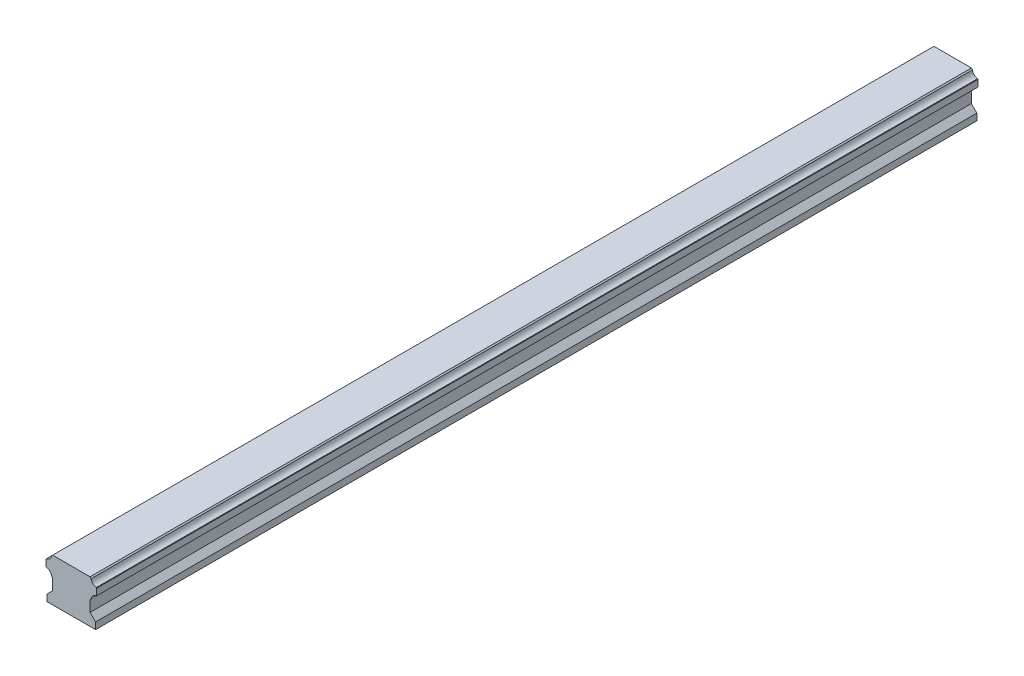
ISO-10303-21;
HEADER;
FILE_DESCRIPTION(('STEP AP214'),'2;1');
FILE_NAME('part.step','',(''),(''),'','','');
FILE_SCHEMA(('AUTOMOTIVE_DESIGN { 1 0 10303 214 1 1 1 1 }'));
ENDSEC;
DATA;
#1=APPLICATION_CONTEXT('core data for automotive mechanical design processes');
#2=APPLICATION_PROTOCOL_DEFINITION('international standard','automotive_design',2000,#1);
#3=PRODUCT_CONTEXT('',#1,'mechanical');
#4=PRODUCT('Part','Part','',(#3));
#5=PRODUCT_RELATED_PRODUCT_CATEGORY('part','',(#4));
#6=PRODUCT_DEFINITION_FORMATION('','',#4);
#7=PRODUCT_DEFINITION_CONTEXT('part definition',#1,'design');
#8=PRODUCT_DEFINITION('design','',#6,#7);
#9=PRODUCT_DEFINITION_SHAPE('','',#8);
#10=(LENGTH_UNIT() NAMED_UNIT(*) SI_UNIT(.MILLI.,.METRE.));
#11=(NAMED_UNIT(*) PLANE_ANGLE_UNIT() SI_UNIT($,.RADIAN.));
#12=(NAMED_UNIT(*) SI_UNIT($,.STERADIAN.) SOLID_ANGLE_UNIT());
#13=UNCERTAINTY_MEASURE_WITH_UNIT(LENGTH_MEASURE(1.E-05),#10,'distance_accuracy_value','');
#14=(GEOMETRIC_REPRESENTATION_CONTEXT(3) GLOBAL_UNCERTAINTY_ASSIGNED_CONTEXT((#13)) GLOBAL_UNIT_ASSIGNED_CONTEXT((#10,
#11,#12)) REPRESENTATION_CONTEXT('',''));
#15=CARTESIAN_POINT('',(0.,0.,0.));
#16=DIRECTION('',(0.,0.,1.));
#17=DIRECTION('',(1.,0.,0.));
#18=AXIS2_PLACEMENT_3D('',#15,#16,#17);
#19=CARTESIAN_POINT('',(12.4987883979856,-8.46322794005069,400.));
#20=DIRECTION('',(0.,0.,-1.));
#21=DIRECTION('',(-1.,0.,0.));
#22=AXIS2_PLACEMENT_3D('',#19,#20,#21);
#23=CYLINDRICAL_SURFACE('',#22,2.5);
#24=CARTESIAN_POINT('',(12.4987883979856,-8.46322794005069,0.));
#25=DIRECTION('',(0.,0.,1.));
#26=DIRECTION('',(1.,0.,0.));
#27=AXIS2_PLACEMENT_3D('',#24,#25,#26);
#28=CIRCLE('',#27,2.5);
#29=CARTESIAN_POINT('',(12.3041980430387,-5.97081252648865,0.));
#30=VERTEX_POINT('',#29);
#31=CARTESIAN_POINT('',(10.0063729844235,-8.26863758510385,0.));
#32=VERTEX_POINT('',#31);
#33=EDGE_CURVE('E211',#30,#32,#28,.T.);
#34=ORIENTED_EDGE('',*,*,#33,.F.);
#35=DIRECTION('',(0.,0.,-1.));
#36=VECTOR('',#35,1.);
#37=CARTESIAN_POINT('',(12.3041980430387,-5.97081252648865,400.));
#38=LINE('',#37,#36);
#39=CARTESIAN_POINT('',(12.3041980430387,-5.97081252648865,400.));
#40=VERTEX_POINT('',#39);
#41=EDGE_CURVE('E11',#40,#30,#38,.T.);
#42=ORIENTED_EDGE('',*,*,#41,.F.);
#43=CARTESIAN_POINT('',(12.4987883979856,-8.46322794005069,400.));
#44=DIRECTION('',(0.,0.,1.));
#45=DIRECTION('',(1.,0.,0.));
#46=AXIS2_PLACEMENT_3D('',#43,#44,#45);
#47=CIRCLE('',#46,2.5);
#48=CARTESIAN_POINT('',(10.0063729844235,-8.26863758510385,400.));
#49=VERTEX_POINT('',#48);
#50=EDGE_CURVE('E271',#40,#49,#47,.T.);
#51=ORIENTED_EDGE('',*,*,#50,.T.);
#52=DIRECTION('',(0.,0.,-1.));
#53=VECTOR('',#52,1.);
#54=CARTESIAN_POINT('',(10.0063729844235,-8.26863758510385,400.));
#55=LINE('',#54,#53);
#56=EDGE_CURVE('E51',#49,#32,#55,.T.);
#57=ORIENTED_EDGE('',*,*,#56,.T.);
#58=EDGE_LOOP('',(#34,#42,#51,#57));
#59=FACE_BOUND('',#58,.T.);
#60=ADVANCED_FACE('F35',(#59),#23,.F.);
#61=CARTESIAN_POINT('',(9.13750528476369,-9.13750528476369,400.));
#62=DIRECTION('',(0.707106781186548,-0.707106781186548,0.));
#63=DIRECTION('',(0.707106781186548,0.707106781186548,0.));
#64=AXIS2_PLACEMENT_3D('',#61,#62,#63);
#65=PLANE('',#64);
#66=DIRECTION('',(-0.707106781186548,-0.707106781186548,0.));
#67=VECTOR('',#66,1.);
#68=CARTESIAN_POINT('',(9.13750528476369,-9.13750528476369,0.));
#69=LINE('',#68,#67);
#70=CARTESIAN_POINT('',(12.4987883979856,-5.77622217154175,0.));
#71=VERTEX_POINT('',#70);
#72=EDGE_CURVE('E213',#71,#30,#69,.T.);
#73=ORIENTED_EDGE('',*,*,#72,.F.);
#74=DIRECTION('',(0.,0.,-1.));
#75=VECTOR('',#74,1.);
#76=CARTESIAN_POINT('',(12.4987883979856,-5.77622217154175,400.));
#77=LINE('',#76,#75);
#78=CARTESIAN_POINT('',(12.4987883979856,-5.77622217154175,400.));
#79=VERTEX_POINT('',#78);
#80=EDGE_CURVE('E43',#79,#71,#77,.T.);
#81=ORIENTED_EDGE('',*,*,#80,.F.);
#82=DIRECTION('',(-0.707106781186548,-0.707106781186548,0.));
#83=VECTOR('',#82,1.);
#84=CARTESIAN_POINT('',(9.13750528476369,-9.13750528476369,400.));
#85=LINE('',#84,#83);
#86=EDGE_CURVE('E330',#79,#40,#85,.T.);
#87=ORIENTED_EDGE('',*,*,#86,.T.);
#88=ORIENTED_EDGE('',*,*,#41,.T.);
#89=EDGE_LOOP('',(#73,#81,#87,#88));
#90=FACE_BOUND('',#89,.T.);
#91=ADVANCED_FACE('F318',(#90),#65,.T.);
#92=CARTESIAN_POINT('',(12.4987883979856,0.,400.));
#93=DIRECTION('',(1.,0.,0.));
#94=DIRECTION('',(0.,0.,-1.));
#95=AXIS2_PLACEMENT_3D('',#92,#93,#94);
#96=PLANE('',#95);
#97=DIRECTION('',(0.,-1.,0.));
#98=VECTOR('',#97,1.);
#99=CARTESIAN_POINT('',(12.4987883979856,0.,0.));
#100=LINE('',#99,#98);
#101=CARTESIAN_POINT('',(12.4987883979856,-2.77622217154181,0.));
#102=VERTEX_POINT('',#101);
#103=EDGE_CURVE('E216',#102,#71,#100,.T.);
#104=ORIENTED_EDGE('',*,*,#103,.F.);
#105=DIRECTION('',(0.,0.,-1.));
#106=VECTOR('',#105,1.);
#107=CARTESIAN_POINT('',(12.4987883979856,-2.77622217154181,400.));
#108=LINE('',#107,#106);
#109=CARTESIAN_POINT('',(12.4987883979856,-2.77622217154181,400.));
#110=VERTEX_POINT('',#109);
#111=EDGE_CURVE('E307',#110,#102,#108,.T.);
#112=ORIENTED_EDGE('',*,*,#111,.F.);
#113=DIRECTION('',(0.,-1.,0.));
#114=VECTOR('',#113,1.);
#115=CARTESIAN_POINT('',(12.4987883979856,0.,400.));
#116=LINE('',#115,#114);
#117=EDGE_CURVE('E314',#110,#79,#116,.T.);
#118=ORIENTED_EDGE('',*,*,#117,.T.);
#119=ORIENTED_EDGE('',*,*,#80,.T.);
#120=EDGE_LOOP('',(#104,#112,#118,#119));
#121=FACE_BOUND('',#120,.T.);
#122=ADVANCED_FACE('F312',(#121),#96,.T.);
#123=CARTESIAN_POINT('',(4.86128311322192,4.86128311322192,400.));
#124=DIRECTION('',(0.707106781186548,0.707106781186548,0.));
#125=DIRECTION('',(-0.707106781186548,0.707106781186548,0.));
#126=AXIS2_PLACEMENT_3D('',#123,#124,#125);
#127=PLANE('',#126);
#128=DIRECTION('',(0.707106781186548,-0.707106781186548,0.));
#129=VECTOR('',#128,1.);
#130=CARTESIAN_POINT('',(4.86128311322192,4.86128311322192,0.));
#131=LINE('',#130,#129);
#132=CARTESIAN_POINT('',(12.3041980430388,-2.58163181659496,0.));
#133=VERTEX_POINT('',#132);
#134=EDGE_CURVE('E219',#133,#102,#131,.T.);
#135=ORIENTED_EDGE('',*,*,#134,.F.);
#136=DIRECTION('',(0.,0.,-1.));
#137=VECTOR('',#136,1.);
#138=CARTESIAN_POINT('',(12.3041980430388,-2.58163181659496,400.));
#139=LINE('',#138,#137);
#140=CARTESIAN_POINT('',(12.3041980430388,-2.58163181659496,400.));
#141=VERTEX_POINT('',#140);
#142=EDGE_CURVE('E305',#141,#133,#139,.T.);
#143=ORIENTED_EDGE('',*,*,#142,.F.);
#144=DIRECTION('',(0.707106781186548,-0.707106781186548,0.));
#145=VECTOR('',#144,1.);
#146=CARTESIAN_POINT('',(4.86128311322192,4.86128311322192,400.));
#147=LINE('',#146,#145);
#148=EDGE_CURVE('E327',#141,#110,#147,.T.);
#149=ORIENTED_EDGE('',*,*,#148,.T.);
#150=ORIENTED_EDGE('',*,*,#111,.T.);
#151=EDGE_LOOP('',(#135,#143,#149,#150));
#152=FACE_BOUND('',#151,.T.);
#153=ADVANCED_FACE('F324',(#152),#127,.T.);
#154=CARTESIAN_POINT('',(12.4987883979856,-0.0892164030329295,400.));
#155=DIRECTION('',(0.,0.,-1.));
#156=DIRECTION('',(-1.,0.,0.));
#157=AXIS2_PLACEMENT_3D('',#154,#155,#156);
#158=CYLINDRICAL_SURFACE('',#157,2.49999999999998);
#159=CARTESIAN_POINT('',(12.4987883979856,-0.0892164030329295,0.));
#160=DIRECTION('',(0.,0.,1.));
#161=DIRECTION('',(1.,0.,0.));
#162=AXIS2_PLACEMENT_3D('',#159,#160,#161);
#163=CIRCLE('',#162,2.49999999999998);
#164=CARTESIAN_POINT('',(10.0063729844236,-0.283806757979913,0.));
#165=VERTEX_POINT('',#164);
#166=EDGE_CURVE('E222',#165,#133,#163,.T.);
#167=ORIENTED_EDGE('',*,*,#166,.F.);
#168=DIRECTION('',(0.,0.,-1.));
#169=VECTOR('',#168,1.);
#170=CARTESIAN_POINT('',(10.0063729844236,-0.283806757979913,400.));
#171=LINE('',#170,#169);
#172=CARTESIAN_POINT('',(10.0063729844236,-0.283806757979913,400.));
#173=VERTEX_POINT('',#172);
#174=EDGE_CURVE('E303',#173,#165,#171,.T.);
#175=ORIENTED_EDGE('',*,*,#174,.F.);
#176=CARTESIAN_POINT('',(12.4987883979856,-0.0892164030329295,400.));
#177=DIRECTION('',(0.,0.,1.));
#178=DIRECTION('',(1.,0.,0.));
#179=AXIS2_PLACEMENT_3D('',#176,#177,#178);
#180=CIRCLE('',#179,2.49999999999998);
#181=EDGE_CURVE('E332',#173,#141,#180,.T.);
#182=ORIENTED_EDGE('',*,*,#181,.T.);
#183=ORIENTED_EDGE('',*,*,#142,.T.);
#184=EDGE_LOOP('',(#167,#175,#182,#183));
#185=FACE_BOUND('',#184,.T.);
#186=ADVANCED_FACE('F406',(#185),#158,.F.);
#187=CARTESIAN_POINT('',(4.86128311322186,4.86128311322186,400.));
#188=DIRECTION('',(0.707106781186548,0.707106781186548,0.));
#189=DIRECTION('',(-0.707106781186548,0.707106781186548,0.));
#190=AXIS2_PLACEMENT_3D('',#187,#188,#189);
#191=PLANE('',#190);
#192=DIRECTION('',(0.707106781186548,-0.707106781186548,0.));
#193=VECTOR('',#192,1.);
#194=CARTESIAN_POINT('',(4.86128311322186,4.86128311322186,0.));
#195=LINE('',#194,#193);
#196=CARTESIAN_POINT('',(9.49878839798586,0.223777828457852,0.));
#197=VERTEX_POINT('',#196);
#198=EDGE_CURVE('E225',#197,#165,#195,.T.);
#199=ORIENTED_EDGE('',*,*,#198,.F.);
#200=DIRECTION('',(0.,0.,-1.));
#201=VECTOR('',#200,1.);
#202=CARTESIAN_POINT('',(9.49878839798586,0.223777828457852,400.));
#203=LINE('',#202,#201);
#204=CARTESIAN_POINT('',(9.49878839798586,0.223777828457852,400.));
#205=VERTEX_POINT('',#204);
#206=EDGE_CURVE('E301',#205,#197,#203,.T.);
#207=ORIENTED_EDGE('',*,*,#206,.F.);
#208=DIRECTION('',(0.707106781186548,-0.707106781186548,0.));
#209=VECTOR('',#208,1.);
#210=CARTESIAN_POINT('',(4.86128311322186,4.86128311322186,400.));
#211=LINE('',#210,#209);
#212=EDGE_CURVE('E338',#205,#173,#211,.T.);
#213=ORIENTED_EDGE('',*,*,#212,.T.);
#214=ORIENTED_EDGE('',*,*,#174,.T.);
#215=EDGE_LOOP('',(#199,#207,#213,#214));
#216=FACE_BOUND('',#215,.T.);
#217=ADVANCED_FACE('F409',(#216),#191,.T.);
#218=CARTESIAN_POINT('',(0.,0.223777828457852,400.));
#219=DIRECTION('',(0.,1.,0.));
#220=DIRECTION('',(0.,0.,1.));
#221=AXIS2_PLACEMENT_3D('',#218,#219,#220);
#222=PLANE('',#221);
#223=DIRECTION('',(1.,0.,0.));
#224=VECTOR('',#223,1.);
#225=CARTESIAN_POINT('',(0.,0.223777828457852,0.));
#226=LINE('',#225,#224);
#227=CARTESIAN_POINT('',(-7.50121160201477,0.223777828457853,0.));
#228=VERTEX_POINT('',#227);
#229=EDGE_CURVE('E228',#228,#197,#226,.T.);
#230=ORIENTED_EDGE('',*,*,#229,.F.);
#231=DIRECTION('',(0.,0.,-1.));
#232=VECTOR('',#231,1.);
#233=CARTESIAN_POINT('',(-7.50121160201477,0.223777828457853,400.));
#234=LINE('',#233,#232);
#235=CARTESIAN_POINT('',(-7.50121160201477,0.223777828457853,400.));
#236=VERTEX_POINT('',#235);
#237=EDGE_CURVE('E299',#236,#228,#234,.T.);
#238=ORIENTED_EDGE('',*,*,#237,.F.);
#239=DIRECTION('',(1.,0.,0.));
#240=VECTOR('',#239,1.);
#241=CARTESIAN_POINT('',(0.,0.223777828457852,400.));
#242=LINE('',#241,#240);
#243=EDGE_CURVE('E341',#236,#205,#242,.T.);
#244=ORIENTED_EDGE('',*,*,#243,.T.);
#245=ORIENTED_EDGE('',*,*,#206,.T.);
#246=EDGE_LOOP('',(#230,#238,#244,#245));
#247=FACE_BOUND('',#246,.T.);
#248=ADVANCED_FACE('F413',(#247),#222,.T.);
#249=CARTESIAN_POINT('',(-3.86249471523632,3.86249471523631,400.));
#250=DIRECTION('',(-0.707106781186549,0.707106781186546,0.));
#251=DIRECTION('',(-0.707106781186546,-0.707106781186549,0.));
#252=AXIS2_PLACEMENT_3D('',#249,#250,#251);
#253=PLANE('',#252);
#254=DIRECTION('',(0.707106781186546,0.707106781186549,0.));
#255=VECTOR('',#254,1.);
#256=CARTESIAN_POINT('',(-3.86249471523632,3.86249471523631,0.));
#257=LINE('',#256,#255);
#258=CARTESIAN_POINT('',(-8.0087961884529,-0.283806757980286,0.));
#259=VERTEX_POINT('',#258);
#260=EDGE_CURVE('E231',#259,#228,#257,.T.);
#261=ORIENTED_EDGE('',*,*,#260,.F.);
#262=DIRECTION('',(0.,0.,-1.));
#263=VECTOR('',#262,1.);
#264=CARTESIAN_POINT('',(-8.0087961884529,-0.283806757980286,400.));
#265=LINE('',#264,#263);
#266=CARTESIAN_POINT('',(-8.0087961884529,-0.283806757980286,400.));
#267=VERTEX_POINT('',#266);
#268=EDGE_CURVE('E297',#267,#259,#265,.T.);
#269=ORIENTED_EDGE('',*,*,#268,.F.);
#270=DIRECTION('',(0.707106781186546,0.707106781186549,0.));
#271=VECTOR('',#270,1.);
#272=CARTESIAN_POINT('',(-3.86249471523632,3.86249471523631,400.));
#273=LINE('',#272,#271);
#274=EDGE_CURVE('E344',#267,#236,#273,.T.);
#275=ORIENTED_EDGE('',*,*,#274,.T.);
#276=ORIENTED_EDGE('',*,*,#237,.T.);
#277=EDGE_LOOP('',(#261,#269,#275,#276));
#278=FACE_BOUND('',#277,.T.);
#279=ADVANCED_FACE('F417',(#278),#253,.T.);
#280=CARTESIAN_POINT('',(-10.5012116020148,-0.0892164030332557,400.));
#281=DIRECTION('',(0.,0.,-1.));
#282=DIRECTION('',(-1.,0.,0.));
#283=AXIS2_PLACEMENT_3D('',#280,#281,#282);
#284=CYLINDRICAL_SURFACE('',#283,2.49999999999983);
#285=CARTESIAN_POINT('',(-10.5012116020148,-0.0892164030332557,0.));
#286=DIRECTION('',(0.,0.,1.));
#287=DIRECTION('',(1.,0.,0.));
#288=AXIS2_PLACEMENT_3D('',#285,#286,#287);
#289=CIRCLE('',#288,2.49999999999983);
#290=CARTESIAN_POINT('',(-10.3066212470681,-2.58163181659515,0.));
#291=VERTEX_POINT('',#290);
#292=EDGE_CURVE('E234',#291,#259,#289,.T.);
#293=ORIENTED_EDGE('',*,*,#292,.F.);
#294=DIRECTION('',(0.,0.,-1.));
#295=VECTOR('',#294,1.);
#296=CARTESIAN_POINT('',(-10.3066212470681,-2.58163181659515,400.));
#297=LINE('',#296,#295);
#298=CARTESIAN_POINT('',(-10.3066212470681,-2.58163181659515,400.));
#299=VERTEX_POINT('',#298);
#300=EDGE_CURVE('E295',#299,#291,#297,.T.);
#301=ORIENTED_EDGE('',*,*,#300,.F.);
#302=CARTESIAN_POINT('',(-10.5012116020148,-0.0892164030332557,400.));
#303=DIRECTION('',(0.,0.,1.));
#304=DIRECTION('',(1.,0.,0.));
#305=AXIS2_PLACEMENT_3D('',#302,#303,#304);
#306=CIRCLE('',#305,2.49999999999983);
#307=EDGE_CURVE('E347',#299,#267,#306,.T.);
#308=ORIENTED_EDGE('',*,*,#307,.T.);
#309=ORIENTED_EDGE('',*,*,#268,.T.);
#310=EDGE_LOOP('',(#293,#301,#308,#309));
#311=FACE_BOUND('',#310,.T.);
#312=ADVANCED_FACE('F421',(#311),#284,.F.);
#313=CARTESIAN_POINT('',(-3.86249471523647,3.86249471523647,400.));
#314=DIRECTION('',(-0.707106781186548,0.707106781186548,0.));
#315=DIRECTION('',(-0.707106781186548,-0.707106781186548,0.));
#316=AXIS2_PLACEMENT_3D('',#313,#314,#315);
#317=PLANE('',#316);
#318=DIRECTION('',(0.707106781186548,0.707106781186548,0.));
#319=VECTOR('',#318,1.);
#320=CARTESIAN_POINT('',(-3.86249471523647,3.86249471523647,0.));
#321=LINE('',#320,#319);
#322=CARTESIAN_POINT('',(-10.5012116020148,-2.77622217154183,0.));
#323=VERTEX_POINT('',#322);
#324=EDGE_CURVE('E237',#323,#291,#321,.T.);
#325=ORIENTED_EDGE('',*,*,#324,.F.);
#326=DIRECTION('',(0.,0.,-1.));
#327=VECTOR('',#326,1.);
#328=CARTESIAN_POINT('',(-10.5012116020148,-2.77622217154183,400.));
#329=LINE('',#328,#327);
#330=CARTESIAN_POINT('',(-10.5012116020148,-2.77622217154183,400.));
#331=VERTEX_POINT('',#330);
#332=EDGE_CURVE('E293',#331,#323,#329,.T.);
#333=ORIENTED_EDGE('',*,*,#332,.F.);
#334=DIRECTION('',(0.707106781186548,0.707106781186548,0.));
#335=VECTOR('',#334,1.);
#336=CARTESIAN_POINT('',(-3.86249471523647,3.86249471523647,400.));
#337=LINE('',#336,#335);
#338=EDGE_CURVE('E350',#331,#299,#337,.T.);
#339=ORIENTED_EDGE('',*,*,#338,.T.);
#340=ORIENTED_EDGE('',*,*,#300,.T.);
#341=EDGE_LOOP('',(#325,#333,#339,#340));
#342=FACE_BOUND('',#341,.T.);
#343=ADVANCED_FACE('F425',(#342),#317,.T.);
#344=CARTESIAN_POINT('',(-10.5012116020148,0.,400.));
#345=DIRECTION('',(-1.,0.,0.));
#346=DIRECTION('',(0.,0.,1.));
#347=AXIS2_PLACEMENT_3D('',#344,#345,#346);
#348=PLANE('',#347);
#349=DIRECTION('',(0.,1.,0.));
#350=VECTOR('',#349,1.);
#351=CARTESIAN_POINT('',(-10.5012116020148,0.,0.));
#352=LINE('',#351,#350);
#353=CARTESIAN_POINT('',(-10.5012116020148,-5.77622217154183,0.));
#354=VERTEX_POINT('',#353);
#355=EDGE_CURVE('E240',#354,#323,#352,.T.);
#356=ORIENTED_EDGE('',*,*,#355,.F.);
#357=DIRECTION('',(0.,0.,-1.));
#358=VECTOR('',#357,1.);
#359=CARTESIAN_POINT('',(-10.5012116020148,-5.77622217154183,400.));
#360=LINE('',#359,#358);
#361=CARTESIAN_POINT('',(-10.5012116020148,-5.77622217154183,400.));
#362=VERTEX_POINT('',#361);
#363=EDGE_CURVE('E291',#362,#354,#360,.T.);
#364=ORIENTED_EDGE('',*,*,#363,.F.);
#365=DIRECTION('',(0.,1.,0.));
#366=VECTOR('',#365,1.);
#367=CARTESIAN_POINT('',(-10.5012116020148,0.,400.));
#368=LINE('',#367,#366);
#369=EDGE_CURVE('E353',#362,#331,#368,.T.);
#370=ORIENTED_EDGE('',*,*,#369,.T.);
#371=ORIENTED_EDGE('',*,*,#332,.T.);
#372=EDGE_LOOP('',(#356,#364,#370,#371));
#373=FACE_BOUND('',#372,.T.);
#374=ADVANCED_FACE('F429',(#373),#348,.T.);
#375=CARTESIAN_POINT('',(-8.1387168867783,-8.1387168867783,400.));
#376=DIRECTION('',(-0.707106781186548,-0.707106781186548,0.));
#377=DIRECTION('',(0.707106781186548,-0.707106781186548,0.));
#378=AXIS2_PLACEMENT_3D('',#375,#376,#377);
#379=PLANE('',#378);
#380=DIRECTION('',(-0.707106781186548,0.707106781186548,0.));
#381=VECTOR('',#380,1.);
#382=CARTESIAN_POINT('',(-8.1387168867783,-8.1387168867783,0.));
#383=LINE('',#382,#381);
#384=CARTESIAN_POINT('',(-10.3066212470679,-5.97081252648868,0.));
#385=VERTEX_POINT('',#384);
#386=EDGE_CURVE('E243',#385,#354,#383,.T.);
#387=ORIENTED_EDGE('',*,*,#386,.F.);
#388=DIRECTION('',(0.,0.,-1.));
#389=VECTOR('',#388,1.);
#390=CARTESIAN_POINT('',(-10.3066212470679,-5.97081252648868,400.));
#391=LINE('',#390,#389);
#392=CARTESIAN_POINT('',(-10.3066212470679,-5.97081252648868,400.));
#393=VERTEX_POINT('',#392);
#394=EDGE_CURVE('E289',#393,#385,#391,.T.);
#395=ORIENTED_EDGE('',*,*,#394,.F.);
#396=DIRECTION('',(-0.707106781186548,0.707106781186548,0.));
#397=VECTOR('',#396,1.);
#398=CARTESIAN_POINT('',(-8.1387168867783,-8.1387168867783,400.));
#399=LINE('',#398,#397);
#400=EDGE_CURVE('E356',#393,#362,#399,.T.);
#401=ORIENTED_EDGE('',*,*,#400,.T.);
#402=ORIENTED_EDGE('',*,*,#363,.T.);
#403=EDGE_LOOP('',(#387,#395,#401,#402));
#404=FACE_BOUND('',#403,.T.);
#405=ADVANCED_FACE('F433',(#404),#379,.T.);
#406=CARTESIAN_POINT('',(-10.5012116020148,-8.46322794005072,400.));
#407=DIRECTION('',(0.,0.,-1.));
#408=DIRECTION('',(-1.,0.,0.));
#409=AXIS2_PLACEMENT_3D('',#406,#407,#408);
#410=CYLINDRICAL_SURFACE('',#409,2.5);
#411=CARTESIAN_POINT('',(-10.5012116020148,-8.46322794005072,0.));
#412=DIRECTION('',(0.,0.,1.));
#413=DIRECTION('',(1.,0.,0.));
#414=AXIS2_PLACEMENT_3D('',#411,#412,#413);
#415=CIRCLE('',#414,2.5);
#416=CARTESIAN_POINT('',(-8.00879618845272,-8.26863758510388,0.));
#417=VERTEX_POINT('',#416);
#418=EDGE_CURVE('E246',#417,#385,#415,.T.);
#419=ORIENTED_EDGE('',*,*,#418,.F.);
#420=DIRECTION('',(0.,0.,-1.));
#421=VECTOR('',#420,1.);
#422=CARTESIAN_POINT('',(-8.00879618845272,-8.26863758510388,400.));
#423=LINE('',#422,#421);
#424=CARTESIAN_POINT('',(-8.00879618845272,-8.26863758510388,400.));
#425=VERTEX_POINT('',#424);
#426=EDGE_CURVE('E287',#425,#417,#423,.T.);
#427=ORIENTED_EDGE('',*,*,#426,.F.);
#428=CARTESIAN_POINT('',(-10.5012116020148,-8.46322794005072,400.));
#429=DIRECTION('',(0.,0.,1.));
#430=DIRECTION('',(1.,0.,0.));
#431=AXIS2_PLACEMENT_3D('',#428,#429,#430);
#432=CIRCLE('',#431,2.5);
#433=EDGE_CURVE('E359',#425,#393,#432,.T.);
#434=ORIENTED_EDGE('',*,*,#433,.T.);
#435=ORIENTED_EDGE('',*,*,#394,.T.);
#436=EDGE_LOOP('',(#419,#427,#434,#435));
#437=FACE_BOUND('',#436,.T.);
#438=ADVANCED_FACE('F437',(#437),#410,.F.);
#439=CARTESIAN_POINT('',(-8.1387168867783,-8.1387168867783,400.));
#440=DIRECTION('',(-0.707106781186548,-0.707106781186548,0.));
#441=DIRECTION('',(0.707106781186548,-0.707106781186548,0.));
#442=AXIS2_PLACEMENT_3D('',#439,#440,#441);
#443=PLANE('',#442);
#444=DIRECTION('',(-0.707106781186548,0.707106781186548,0.));
#445=VECTOR('',#444,1.);
#446=CARTESIAN_POINT('',(-8.1387168867783,-8.1387168867783,0.));
#447=LINE('',#446,#445);
#448=CARTESIAN_POINT('',(-7.50121160201465,-8.77622217154195,0.));
#449=VERTEX_POINT('',#448);
#450=EDGE_CURVE('E249',#449,#417,#447,.T.);
#451=ORIENTED_EDGE('',*,*,#450,.F.);
#452=DIRECTION('',(0.,0.,-1.));
#453=VECTOR('',#452,1.);
#454=CARTESIAN_POINT('',(-7.50121160201465,-8.77622217154195,400.));
#455=LINE('',#454,#453);
#456=CARTESIAN_POINT('',(-7.50121160201465,-8.77622217154195,400.));
#457=VERTEX_POINT('',#456);
#458=EDGE_CURVE('E285',#457,#449,#455,.T.);
#459=ORIENTED_EDGE('',*,*,#458,.F.);
#460=DIRECTION('',(-0.707106781186548,0.707106781186548,0.));
#461=VECTOR('',#460,1.);
#462=CARTESIAN_POINT('',(-8.1387168867783,-8.1387168867783,400.));
#463=LINE('',#462,#461);
#464=EDGE_CURVE('E362',#457,#425,#463,.T.);
#465=ORIENTED_EDGE('',*,*,#464,.T.);
#466=ORIENTED_EDGE('',*,*,#426,.T.);
#467=EDGE_LOOP('',(#451,#459,#465,#466));
#468=FACE_BOUND('',#467,.T.);
#469=ADVANCED_FACE('F441',(#468),#443,.T.);
#470=CARTESIAN_POINT('',(-7.50121160201465,0.,400.));
#471=DIRECTION('',(-1.,0.,0.));
#472=DIRECTION('',(0.,0.,1.));
#473=AXIS2_PLACEMENT_3D('',#470,#471,#472);
#474=PLANE('',#473);
#475=DIRECTION('',(0.,1.,0.));
#476=VECTOR('',#475,1.);
#477=CARTESIAN_POINT('',(-7.50121160201465,0.,0.));
#478=LINE('',#477,#476);
#479=CARTESIAN_POINT('',(-7.50121160201465,-13.7762221715419,0.));
#480=VERTEX_POINT('',#479);
#481=EDGE_CURVE('E252',#480,#449,#478,.T.);
#482=ORIENTED_EDGE('',*,*,#481,.F.);
#483=DIRECTION('',(0.,0.,-1.));
#484=VECTOR('',#483,1.);
#485=CARTESIAN_POINT('',(-7.50121160201465,-13.7762221715419,400.));
#486=LINE('',#485,#484);
#487=CARTESIAN_POINT('',(-7.50121160201465,-13.7762221715419,400.));
#488=VERTEX_POINT('',#487);
#489=EDGE_CURVE('E283',#488,#480,#486,.T.);
#490=ORIENTED_EDGE('',*,*,#489,.F.);
#491=DIRECTION('',(0.,1.,0.));
#492=VECTOR('',#491,1.);
#493=CARTESIAN_POINT('',(-7.50121160201465,0.,400.));
#494=LINE('',#493,#492);
#495=EDGE_CURVE('E365',#488,#457,#494,.T.);
#496=ORIENTED_EDGE('',*,*,#495,.T.);
#497=ORIENTED_EDGE('',*,*,#458,.T.);
#498=EDGE_LOOP('',(#482,#490,#496,#497));
#499=FACE_BOUND('',#498,.T.);
#500=ADVANCED_FACE('F445',(#499),#474,.T.);
#501=CARTESIAN_POINT('',(3.13750528476362,-3.13750528476363,400.));
#502=DIRECTION('',(-0.707106781186547,0.707106781186548,0.));
#503=DIRECTION('',(-0.707106781186548,-0.707106781186547,0.));
#504=AXIS2_PLACEMENT_3D('',#501,#502,#503);
#505=PLANE('',#504);
#506=DIRECTION('',(0.707106781186548,0.707106781186547,0.));
#507=VECTOR('',#506,1.);
#508=CARTESIAN_POINT('',(3.13750528476362,-3.13750528476363,0.));
#509=LINE('',#508,#507);
#510=CARTESIAN_POINT('',(-10.0012116020146,-16.2762221715419,0.));
#511=VERTEX_POINT('',#510);
#512=EDGE_CURVE('E255',#511,#480,#509,.T.);
#513=ORIENTED_EDGE('',*,*,#512,.F.);
#514=DIRECTION('',(0.,0.,-1.));
#515=VECTOR('',#514,1.);
#516=CARTESIAN_POINT('',(-10.0012116020146,-16.2762221715419,400.));
#517=LINE('',#516,#515);
#518=CARTESIAN_POINT('',(-10.0012116020146,-16.2762221715419,400.));
#519=VERTEX_POINT('',#518);
#520=EDGE_CURVE('E281',#519,#511,#517,.T.);
#521=ORIENTED_EDGE('',*,*,#520,.F.);
#522=DIRECTION('',(0.707106781186548,0.707106781186547,0.));
#523=VECTOR('',#522,1.);
#524=CARTESIAN_POINT('',(3.13750528476362,-3.13750528476363,400.));
#525=LINE('',#524,#523);
#526=EDGE_CURVE('E368',#519,#488,#525,.T.);
#527=ORIENTED_EDGE('',*,*,#526,.T.);
#528=ORIENTED_EDGE('',*,*,#489,.T.);
#529=EDGE_LOOP('',(#513,#521,#527,#528));
#530=FACE_BOUND('',#529,.T.);
#531=ADVANCED_FACE('F449',(#530),#505,.T.);
#532=CARTESIAN_POINT('',(-10.0012116020146,0.,400.));
#533=DIRECTION('',(1.,0.,0.));
#534=DIRECTION('',(0.,0.,-1.));
#535=AXIS2_PLACEMENT_3D('',#532,#533,#534);
#536=PLANE('',#535);
#537=DIRECTION('',(0.,-1.,0.));
#538=VECTOR('',#537,1.);
#539=CARTESIAN_POINT('',(-10.0012116020146,0.,0.));
#540=LINE('',#539,#538);
#541=CARTESIAN_POINT('',(-10.0012116020146,-19.3144029317294,0.));
#542=VERTEX_POINT('',#541);
#543=EDGE_CURVE('E258',#511,#542,#540,.T.);
#544=ORIENTED_EDGE('',*,*,#543,.T.);
#545=DIRECTION('',(0.,0.,-1.));
#546=VECTOR('',#545,1.);
#547=CARTESIAN_POINT('',(-10.0012116020146,-19.3144029317294,400.));
#548=LINE('',#547,#546);
#549=CARTESIAN_POINT('',(-10.0012116020146,-19.3144029317294,400.));
#550=VERTEX_POINT('',#549);
#551=EDGE_CURVE('E278',#550,#542,#548,.T.);
#552=ORIENTED_EDGE('',*,*,#551,.F.);
#553=DIRECTION('',(0.,-1.,0.));
#554=VECTOR('',#553,1.);
#555=CARTESIAN_POINT('',(-10.0012116020146,0.,400.));
#556=LINE('',#555,#554);
#557=EDGE_CURVE('E371',#519,#550,#556,.T.);
#558=ORIENTED_EDGE('',*,*,#557,.F.);
#559=ORIENTED_EDGE('',*,*,#520,.T.);
#560=EDGE_LOOP('',(#544,#552,#558,#559));
#561=FACE_BOUND('',#560,.T.);
#562=ADVANCED_FACE('F453',(#561),#536,.F.);
#563=CARTESIAN_POINT('',(0.,-19.3144029317294,400.));
#564=DIRECTION('',(0.,1.,0.));
#565=DIRECTION('',(0.,0.,1.));
#566=AXIS2_PLACEMENT_3D('',#563,#564,#565);
#567=PLANE('',#566);
#568=DIRECTION('',(1.,0.,0.));
#569=VECTOR('',#568,1.);
#570=CARTESIAN_POINT('',(0.,-19.3144029317294,0.));
#571=LINE('',#570,#569);
#572=CARTESIAN_POINT('',(11.9987883979856,-19.3144029317294,0.));
#573=VERTEX_POINT('',#572);
#574=EDGE_CURVE('E260',#542,#573,#571,.T.);
#575=ORIENTED_EDGE('',*,*,#574,.T.);
#576=DIRECTION('',(0.,0.,-1.));
#577=VECTOR('',#576,1.);
#578=CARTESIAN_POINT('',(11.9987883979856,-19.3144029317294,400.));
#579=LINE('',#578,#577);
#580=CARTESIAN_POINT('',(11.9987883979856,-19.3144029317294,400.));
#581=VERTEX_POINT('',#580);
#582=EDGE_CURVE('E275',#581,#573,#579,.T.);
#583=ORIENTED_EDGE('',*,*,#582,.F.);
#584=DIRECTION('',(1.,0.,0.));
#585=VECTOR('',#584,1.);
#586=CARTESIAN_POINT('',(0.,-19.3144029317294,400.));
#587=LINE('',#586,#585);
#588=EDGE_CURVE('E373',#550,#581,#587,.T.);
#589=ORIENTED_EDGE('',*,*,#588,.F.);
#590=ORIENTED_EDGE('',*,*,#551,.T.);
#591=EDGE_LOOP('',(#575,#583,#589,#590));
#592=FACE_BOUND('',#591,.T.);
#593=ADVANCED_FACE('F380',(#592),#567,.F.);
#594=CARTESIAN_POINT('',(11.9987883979856,0.,400.));
#595=DIRECTION('',(-1.,0.,0.));
#596=DIRECTION('',(0.,0.,1.));
#597=AXIS2_PLACEMENT_3D('',#594,#595,#596);
#598=PLANE('',#597);
#599=DIRECTION('',(0.,1.,0.));
#600=VECTOR('',#599,1.);
#601=CARTESIAN_POINT('',(11.9987883979856,0.,0.));
#602=LINE('',#601,#600);
#603=CARTESIAN_POINT('',(11.9987883979856,-16.2762221715418,0.));
#604=VERTEX_POINT('',#603);
#605=EDGE_CURVE('E262',#573,#604,#602,.T.);
#606=ORIENTED_EDGE('',*,*,#605,.T.);
#607=DIRECTION('',(0.,0.,-1.));
#608=VECTOR('',#607,1.);
#609=CARTESIAN_POINT('',(11.9987883979856,-16.2762221715418,400.));
#610=LINE('',#609,#608);
#611=CARTESIAN_POINT('',(11.9987883979856,-16.2762221715418,400.));
#612=VERTEX_POINT('',#611);
#613=EDGE_CURVE('E194',#612,#604,#610,.T.);
#614=ORIENTED_EDGE('',*,*,#613,.F.);
#615=DIRECTION('',(0.,1.,0.));
#616=VECTOR('',#615,1.);
#617=CARTESIAN_POINT('',(11.9987883979856,0.,400.));
#618=LINE('',#617,#616);
#619=EDGE_CURVE('E202',#581,#612,#618,.T.);
#620=ORIENTED_EDGE('',*,*,#619,.F.);
#621=ORIENTED_EDGE('',*,*,#582,.T.);
#622=EDGE_LOOP('',(#606,#614,#620,#621));
#623=FACE_BOUND('',#622,.T.);
#624=ADVANCED_FACE('F384',(#623),#598,.F.);
#625=CARTESIAN_POINT('',(-2.13871688677806,-2.13871688677806,400.));
#626=DIRECTION('',(0.707106781186548,0.707106781186548,0.));
#627=DIRECTION('',(-0.707106781186548,0.707106781186548,0.));
#628=AXIS2_PLACEMENT_3D('',#625,#626,#627);
#629=PLANE('',#628);
#630=DIRECTION('',(0.707106781186548,-0.707106781186548,0.));
#631=VECTOR('',#630,1.);
#632=CARTESIAN_POINT('',(-2.13871688677806,-2.13871688677806,0.));
#633=LINE('',#632,#631);
#634=CARTESIAN_POINT('',(9.49878839798558,-13.7762221715417,0.));
#635=VERTEX_POINT('',#634);
#636=EDGE_CURVE('E190',#635,#604,#633,.T.);
#637=ORIENTED_EDGE('',*,*,#636,.F.);
#638=DIRECTION('',(0.,0.,-1.));
#639=VECTOR('',#638,1.);
#640=CARTESIAN_POINT('',(9.49878839798558,-13.7762221715417,400.));
#641=LINE('',#640,#639);
#642=CARTESIAN_POINT('',(9.49878839798558,-13.7762221715417,400.));
#643=VERTEX_POINT('',#642);
#644=EDGE_CURVE('E185',#643,#635,#641,.T.);
#645=ORIENTED_EDGE('',*,*,#644,.F.);
#646=DIRECTION('',(0.707106781186548,-0.707106781186548,0.));
#647=VECTOR('',#646,1.);
#648=CARTESIAN_POINT('',(-2.13871688677806,-2.13871688677806,400.));
#649=LINE('',#648,#647);
#650=EDGE_CURVE('E188',#643,#612,#649,.T.);
#651=ORIENTED_EDGE('',*,*,#650,.T.);
#652=ORIENTED_EDGE('',*,*,#613,.T.);
#653=EDGE_LOOP('',(#637,#645,#651,#652));
#654=FACE_BOUND('',#653,.T.);
#655=ADVANCED_FACE('F187',(#654),#629,.T.);
#656=CARTESIAN_POINT('',(9.49878839798558,0.,400.));
#657=DIRECTION('',(1.,0.,0.));
#658=DIRECTION('',(0.,0.,-1.));
#659=AXIS2_PLACEMENT_3D('',#656,#657,#658);
#660=PLANE('',#659);
#661=DIRECTION('',(0.,-1.,0.));
#662=VECTOR('',#661,1.);
#663=CARTESIAN_POINT('',(9.49878839798558,0.,0.));
#664=LINE('',#663,#662);
#665=CARTESIAN_POINT('',(9.49878839798558,-8.77622217154181,0.));
#666=VERTEX_POINT('',#665);
#667=EDGE_CURVE('E266',#666,#635,#664,.T.);
#668=ORIENTED_EDGE('',*,*,#667,.F.);
#669=DIRECTION('',(0.,0.,-1.));
#670=VECTOR('',#669,1.);
#671=CARTESIAN_POINT('',(9.49878839798558,-8.77622217154181,400.));
#672=LINE('',#671,#670);
#673=CARTESIAN_POINT('',(9.49878839798558,-8.77622217154181,400.));
#674=VERTEX_POINT('',#673);
#675=EDGE_CURVE('E118',#674,#666,#672,.T.);
#676=ORIENTED_EDGE('',*,*,#675,.F.);
#677=DIRECTION('',(0.,-1.,0.));
#678=VECTOR('',#677,1.);
#679=CARTESIAN_POINT('',(9.49878839798558,0.,400.));
#680=LINE('',#679,#678);
#681=EDGE_CURVE('E200',#674,#643,#680,.T.);
#682=ORIENTED_EDGE('',*,*,#681,.T.);
#683=ORIENTED_EDGE('',*,*,#644,.T.);
#684=EDGE_LOOP('',(#668,#676,#682,#683));
#685=FACE_BOUND('',#684,.T.);
#686=ADVANCED_FACE('F205',(#685),#660,.T.);
#687=CARTESIAN_POINT('',(9.13750528476369,-9.13750528476369,400.));
#688=DIRECTION('',(0.707106781186548,-0.707106781186548,0.));
#689=DIRECTION('',(0.707106781186548,0.707106781186548,0.));
#690=AXIS2_PLACEMENT_3D('',#687,#688,#689);
#691=PLANE('',#690);
#692=DIRECTION('',(-0.707106781186548,-0.707106781186548,0.));
#693=VECTOR('',#692,1.);
#694=CARTESIAN_POINT('',(9.13750528476369,-9.13750528476369,0.));
#695=LINE('',#694,#693);
#696=EDGE_CURVE('E268',#32,#666,#695,.T.);
#697=ORIENTED_EDGE('',*,*,#696,.F.);
#698=ORIENTED_EDGE('',*,*,#56,.F.);
#699=DIRECTION('',(-0.707106781186548,-0.707106781186548,0.));
#700=VECTOR('',#699,1.);
#701=CARTESIAN_POINT('',(9.13750528476369,-9.13750528476369,400.));
#702=LINE('',#701,#700);
#703=EDGE_CURVE('E206',#49,#674,#702,.T.);
#704=ORIENTED_EDGE('',*,*,#703,.T.);
#705=ORIENTED_EDGE('',*,*,#675,.T.);
#706=EDGE_LOOP('',(#697,#698,#704,#705));
#707=FACE_BOUND('',#706,.T.);
#708=ADVANCED_FACE('F385',(#707),#691,.T.);
#709=CARTESIAN_POINT('',(0.,0.,400.));
#710=DIRECTION('',(0.,0.,1.));
#711=DIRECTION('',(1.,0.,0.));
#712=AXIS2_PLACEMENT_3D('',#709,#710,#711);
#713=PLANE('',#712);
#714=ORIENTED_EDGE('',*,*,#50,.F.);
#715=ORIENTED_EDGE('',*,*,#86,.F.);
#716=ORIENTED_EDGE('',*,*,#117,.F.);
#717=ORIENTED_EDGE('',*,*,#148,.F.);
#718=ORIENTED_EDGE('',*,*,#181,.F.);
#719=ORIENTED_EDGE('',*,*,#212,.F.);
#720=ORIENTED_EDGE('',*,*,#243,.F.);
#721=ORIENTED_EDGE('',*,*,#274,.F.);
#722=ORIENTED_EDGE('',*,*,#307,.F.);
#723=ORIENTED_EDGE('',*,*,#338,.F.);
#724=ORIENTED_EDGE('',*,*,#369,.F.);
#725=ORIENTED_EDGE('',*,*,#400,.F.);
#726=ORIENTED_EDGE('',*,*,#433,.F.);
#727=ORIENTED_EDGE('',*,*,#464,.F.);
#728=ORIENTED_EDGE('',*,*,#495,.F.);
#729=ORIENTED_EDGE('',*,*,#526,.F.);
#730=ORIENTED_EDGE('',*,*,#557,.T.);
#731=ORIENTED_EDGE('',*,*,#588,.T.);
#732=ORIENTED_EDGE('',*,*,#619,.T.);
#733=ORIENTED_EDGE('',*,*,#650,.F.);
#734=ORIENTED_EDGE('',*,*,#681,.F.);
#735=ORIENTED_EDGE('',*,*,#703,.F.);
#736=EDGE_LOOP('',(#714,#715,#716,#717,#718,#719,#720,#721,#722,#723,#724,#725,#726,#727,#728,
#729,#730,#731,#732,#733,#734,#735));
#737=FACE_BOUND('',#736,.T.);
#738=ADVANCED_FACE('F198',(#737),#713,.T.);
#739=CARTESIAN_POINT('',(0.,0.,0.));
#740=DIRECTION('',(0.,0.,1.));
#741=DIRECTION('',(1.,0.,0.));
#742=AXIS2_PLACEMENT_3D('',#739,#740,#741);
#743=PLANE('',#742);
#744=ORIENTED_EDGE('',*,*,#33,.T.);
#745=ORIENTED_EDGE('',*,*,#696,.T.);
#746=ORIENTED_EDGE('',*,*,#667,.T.);
#747=ORIENTED_EDGE('',*,*,#636,.T.);
#748=ORIENTED_EDGE('',*,*,#605,.F.);
#749=ORIENTED_EDGE('',*,*,#574,.F.);
#750=ORIENTED_EDGE('',*,*,#543,.F.);
#751=ORIENTED_EDGE('',*,*,#512,.T.);
#752=ORIENTED_EDGE('',*,*,#481,.T.);
#753=ORIENTED_EDGE('',*,*,#450,.T.);
#754=ORIENTED_EDGE('',*,*,#418,.T.);
#755=ORIENTED_EDGE('',*,*,#386,.T.);
#756=ORIENTED_EDGE('',*,*,#355,.T.);
#757=ORIENTED_EDGE('',*,*,#324,.T.);
#758=ORIENTED_EDGE('',*,*,#292,.T.);
#759=ORIENTED_EDGE('',*,*,#260,.T.);
#760=ORIENTED_EDGE('',*,*,#229,.T.);
#761=ORIENTED_EDGE('',*,*,#198,.T.);
#762=ORIENTED_EDGE('',*,*,#166,.T.);
#763=ORIENTED_EDGE('',*,*,#134,.T.);
#764=ORIENTED_EDGE('',*,*,#103,.T.);
#765=ORIENTED_EDGE('',*,*,#72,.T.);
#766=EDGE_LOOP('',(#744,#745,#746,#747,#748,#749,#750,#751,#752,#753,#754,#755,#756,#757,#758,
#759,#760,#761,#762,#763,#764,#765));
#767=FACE_BOUND('',#766,.T.);
#768=ADVANCED_FACE('F320',(#767),#743,.F.);
#769=CLOSED_SHELL('',(#60,#91,#122,#153,#186,#217,#248,#279,#312,#343,#374,#405,#438,#469,#500,
#531,#562,#593,#624,#655,#686,#708,#738,#768));
#770=MANIFOLD_SOLID_BREP('B2',#769);
#771=ADVANCED_BREP_SHAPE_REPRESENTATION('',(#18,#770),#14);
#772=SHAPE_DEFINITION_REPRESENTATION(#9,#771);
ENDSEC;
END-ISO-10303-21;
